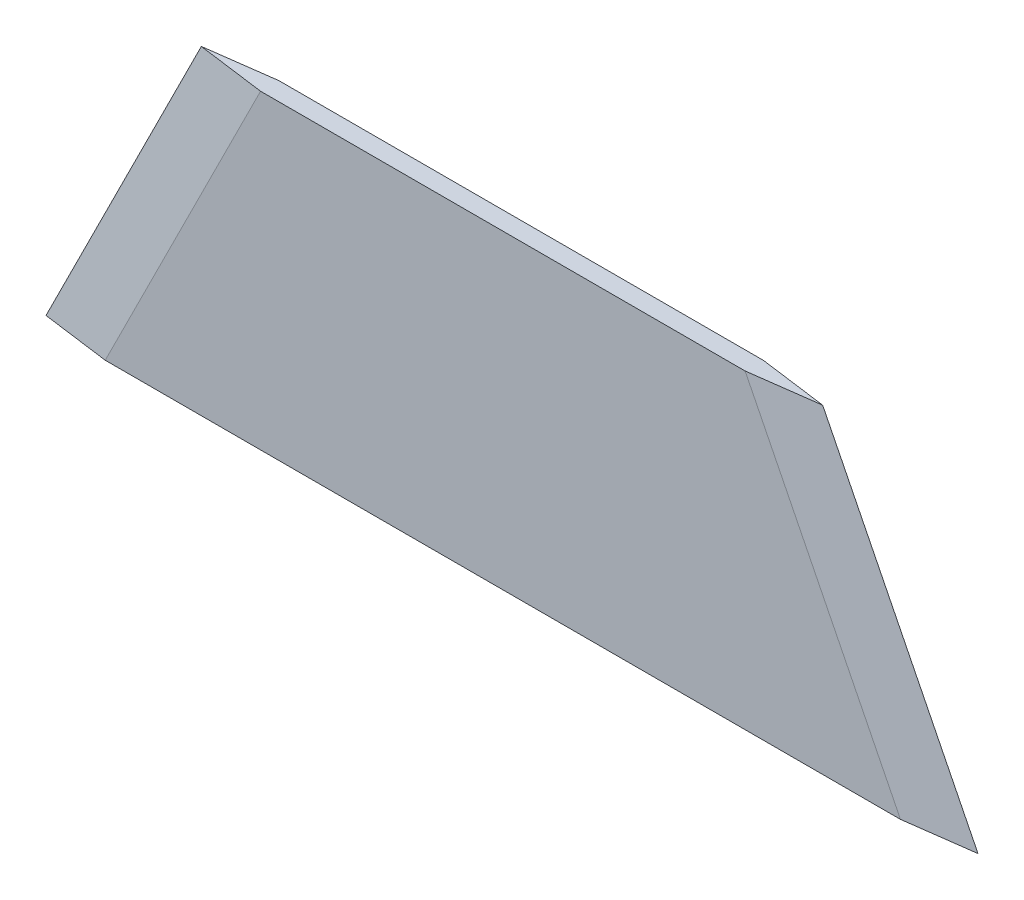
ISO-10303-21;
HEADER;
FILE_DESCRIPTION(('STEP AP214'),'2;1');
FILE_NAME('part.step','',(''),(''),'','','');
FILE_SCHEMA(('AUTOMOTIVE_DESIGN { 1 0 10303 214 1 1 1 1 }'));
ENDSEC;
DATA;
#1=APPLICATION_CONTEXT('core data for automotive mechanical design processes');
#2=APPLICATION_PROTOCOL_DEFINITION('international standard','automotive_design',2000,#1);
#3=PRODUCT_CONTEXT('',#1,'mechanical');
#4=PRODUCT('Part','Part','',(#3));
#5=PRODUCT_RELATED_PRODUCT_CATEGORY('part','',(#4));
#6=PRODUCT_DEFINITION_FORMATION('','',#4);
#7=PRODUCT_DEFINITION_CONTEXT('part definition',#1,'design');
#8=PRODUCT_DEFINITION('design','',#6,#7);
#9=PRODUCT_DEFINITION_SHAPE('','',#8);
#10=(LENGTH_UNIT() NAMED_UNIT(*) SI_UNIT(.MILLI.,.METRE.));
#11=(NAMED_UNIT(*) PLANE_ANGLE_UNIT() SI_UNIT($,.RADIAN.));
#12=(NAMED_UNIT(*) SI_UNIT($,.STERADIAN.) SOLID_ANGLE_UNIT());
#13=UNCERTAINTY_MEASURE_WITH_UNIT(LENGTH_MEASURE(1.E-05),#10,'distance_accuracy_value','');
#14=(GEOMETRIC_REPRESENTATION_CONTEXT(3) GLOBAL_UNCERTAINTY_ASSIGNED_CONTEXT((#13)) GLOBAL_UNIT_ASSIGNED_CONTEXT((#10,
#11,#12)) REPRESENTATION_CONTEXT('',''));
#15=CARTESIAN_POINT('',(0.,0.,0.));
#16=DIRECTION('',(0.,0.,1.));
#17=DIRECTION('',(1.,0.,0.));
#18=AXIS2_PLACEMENT_3D('',#15,#16,#17);
#19=CARTESIAN_POINT('',(0.,0.,1.4986));
#20=DIRECTION('',(0.,1.,0.));
#21=DIRECTION('',(0.,0.,1.));
#22=AXIS2_PLACEMENT_3D('',#19,#20,#21);
#23=PLANE('',#22);
#24=DIRECTION('',(1.,0.,0.));
#25=VECTOR('',#24,1.);
#26=CARTESIAN_POINT('',(0.,0.,-1.4986));
#27=LINE('',#26,#25);
#28=CARTESIAN_POINT('',(11.180339887499,0.,-1.4986));
#29=VERTEX_POINT('',#28);
#30=CARTESIAN_POINT('',(141.219660112501,0.,-1.4986));
#31=VERTEX_POINT('',#30);
#32=EDGE_CURVE('E93',#29,#31,#27,.T.);
#33=ORIENTED_EDGE('',*,*,#32,.T.);
#34=DIRECTION('',(0.991136054914381,0.,0.132850745759128));
#35=VECTOR('',#34,1.);
#36=CARTESIAN_POINT('',(127.448292744478,0.,-3.34449836672097));
#37=LINE('',#36,#35);
#38=CARTESIAN_POINT('',(152.4,0.,0.));
#39=VERTEX_POINT('',#38);
#40=EDGE_CURVE('E51',#31,#39,#37,.T.);
#41=ORIENTED_EDGE('',*,*,#40,.T.);
#42=DIRECTION('',(0.991136054914382,0.,-0.132850745759119));
#43=VECTOR('',#42,1.);
#44=CARTESIAN_POINT('',(113.474214302647,0.,5.21756789444983));
#45=LINE('',#44,#43);
#46=CARTESIAN_POINT('',(141.219660112501,0.,1.4986));
#47=VERTEX_POINT('',#46);
#48=EDGE_CURVE('E58',#39,#47,#45,.F.);
#49=ORIENTED_EDGE('',*,*,#48,.T.);
#50=DIRECTION('',(1.,0.,0.));
#51=VECTOR('',#50,1.);
#52=CARTESIAN_POINT('',(0.,0.,1.4986));
#53=LINE('',#52,#51);
#54=CARTESIAN_POINT('',(11.1803398874992,0.,1.4986));
#55=VERTEX_POINT('',#54);
#56=EDGE_CURVE('E162',#55,#47,#53,.T.);
#57=ORIENTED_EDGE('',*,*,#56,.F.);
#58=DIRECTION('',(0.991136054914382,0.,0.132850745759119));
#59=VECTOR('',#58,1.);
#60=CARTESIAN_POINT('',(8.98373699072674,0.,1.20416985438484));
#61=LINE('',#60,#59);
#62=CARTESIAN_POINT('',(0.,0.,0.));
#63=VERTEX_POINT('',#62);
#64=EDGE_CURVE('E95',#55,#63,#61,.F.);
#65=ORIENTED_EDGE('',*,*,#64,.T.);
#66=DIRECTION('',(0.991136054914381,0.,-0.132850745759128));
#67=VECTOR('',#66,1.);
#68=CARTESIAN_POINT('',(0.,0.,0.));
#69=LINE('',#68,#67);
#70=EDGE_CURVE('E91',#63,#29,#69,.T.);
#71=ORIENTED_EDGE('',*,*,#70,.T.);
#72=EDGE_LOOP('',(#33,#41,#49,#57,#65,#71));
#73=FACE_BOUND('',#72,.T.);
#74=ADVANCED_FACE('F40',(#73),#23,.F.);
#75=CARTESIAN_POINT('',(25.3999999999992,50.8,1.4986));
#76=DIRECTION('',(0.,-1.,0.));
#77=DIRECTION('',(0.,0.,-1.));
#78=AXIS2_PLACEMENT_3D('',#75,#76,#77);
#79=PLANE('',#78);
#80=DIRECTION('',(-0.991136054914383,0.,0.132850745759119));
#81=VECTOR('',#80,1.);
#82=CARTESIAN_POINT('',(113.025921558169,50.8,1.87306952772901));
#83=LINE('',#82,#81);
#84=CARTESIAN_POINT('',(115.819660112501,50.8,1.4986));
#85=VERTEX_POINT('',#84);
#86=CARTESIAN_POINT('',(127.,50.8,0.));
#87=VERTEX_POINT('',#86);
#88=EDGE_CURVE('E131',#85,#87,#83,.F.);
#89=ORIENTED_EDGE('',*,*,#88,.T.);
#90=DIRECTION('',(-0.991136054914381,0.,-0.132850745759128));
#91=VECTOR('',#90,1.);
#92=CARTESIAN_POINT('',(127.,50.8,0.));
#93=LINE('',#92,#91);
#94=CARTESIAN_POINT('',(115.819660112501,50.8,-1.4986));
#95=VERTEX_POINT('',#94);
#96=EDGE_CURVE('E136',#87,#95,#93,.T.);
#97=ORIENTED_EDGE('',*,*,#96,.T.);
#98=DIRECTION('',(-1.,0.,0.));
#99=VECTOR('',#98,1.);
#100=CARTESIAN_POINT('',(25.3999999999992,50.8,-1.4986));
#101=LINE('',#100,#99);
#102=CARTESIAN_POINT('',(36.5803398874981,50.8,-1.4986));
#103=VERTEX_POINT('',#102);
#104=EDGE_CURVE('E111',#95,#103,#101,.T.);
#105=ORIENTED_EDGE('',*,*,#104,.T.);
#106=DIRECTION('',(-0.991136054914381,0.,0.132850745759128));
#107=VECTOR('',#106,1.);
#108=CARTESIAN_POINT('',(0.448292744477552,50.8,3.34449836672111));
#109=LINE('',#108,#107);
#110=CARTESIAN_POINT('',(25.3999999999992,50.8,0.));
#111=VERTEX_POINT('',#110);
#112=EDGE_CURVE('E116',#103,#111,#109,.T.);
#113=ORIENTED_EDGE('',*,*,#112,.T.);
#114=DIRECTION('',(-0.991136054914383,0.,-0.132850745759119));
#115=VECTOR('',#114,1.);
#116=CARTESIAN_POINT('',(9.43202973520418,50.8,-2.14032851233598));
#117=LINE('',#116,#115);
#118=CARTESIAN_POINT('',(36.5803398874984,50.8,1.4986));
#119=VERTEX_POINT('',#118);
#120=EDGE_CURVE('E118',#111,#119,#117,.F.);
#121=ORIENTED_EDGE('',*,*,#120,.T.);
#122=DIRECTION('',(-1.,0.,0.));
#123=VECTOR('',#122,1.);
#124=CARTESIAN_POINT('',(25.3999999999992,50.8,1.4986));
#125=LINE('',#124,#123);
#126=EDGE_CURVE('E174',#85,#119,#125,.T.);
#127=ORIENTED_EDGE('',*,*,#126,.F.);
#128=EDGE_LOOP('',(#89,#97,#105,#113,#121,#127));
#129=FACE_BOUND('',#128,.T.);
#130=ADVANCED_FACE('F155',(#129),#79,.F.);
#131=CARTESIAN_POINT('',(0.,0.,1.4986));
#132=DIRECTION('',(0.,0.,-1.));
#133=DIRECTION('',(-1.,0.,0.));
#134=AXIS2_PLACEMENT_3D('',#131,#132,#133);
#135=PLANE('',#134);
#136=ORIENTED_EDGE('',*,*,#56,.T.);
#137=DIRECTION('',(-0.447213595499958,0.894427190999916,0.));
#138=VECTOR('',#137,1.);
#139=CARTESIAN_POINT('',(112.975728090001,56.4878640450003,1.4986));
#140=LINE('',#139,#138);
#141=EDGE_CURVE('E11',#47,#85,#140,.T.);
#142=ORIENTED_EDGE('',*,*,#141,.T.);
#143=ORIENTED_EDGE('',*,*,#126,.T.);
#144=DIRECTION('',(-0.447213595499958,-0.894427190999916,0.));
#145=VECTOR('',#144,1.);
#146=CARTESIAN_POINT('',(8.94427190999936,-4.47213595499969,1.4986));
#147=LINE('',#146,#145);
#148=EDGE_CURVE('E128',#119,#55,#147,.T.);
#149=ORIENTED_EDGE('',*,*,#148,.T.);
#150=EDGE_LOOP('',(#136,#142,#143,#149));
#151=FACE_BOUND('',#150,.T.);
#152=ADVANCED_FACE('F182',(#151),#135,.F.);
#153=CARTESIAN_POINT('',(0.,0.,-1.4986));
#154=DIRECTION('',(0.,0.,-1.));
#155=DIRECTION('',(-1.,0.,0.));
#156=AXIS2_PLACEMENT_3D('',#153,#154,#155);
#157=PLANE('',#156);
#158=ORIENTED_EDGE('',*,*,#104,.F.);
#159=DIRECTION('',(0.447213595499958,-0.894427190999916,0.));
#160=VECTOR('',#159,1.);
#161=CARTESIAN_POINT('',(143.455728090001,-4.47213595499959,-1.4986));
#162=LINE('',#161,#160);
#163=EDGE_CURVE('E109',#95,#31,#162,.T.);
#164=ORIENTED_EDGE('',*,*,#163,.T.);
#165=ORIENTED_EDGE('',*,*,#32,.F.);
#166=DIRECTION('',(0.447213595499958,0.894427190999916,0.));
#167=VECTOR('',#166,1.);
#168=CARTESIAN_POINT('',(34.3442719099991,46.3278640450004,-1.4986));
#169=LINE('',#168,#167);
#170=EDGE_CURVE('E101',#29,#103,#169,.T.);
#171=ORIENTED_EDGE('',*,*,#170,.T.);
#172=EDGE_LOOP('',(#158,#164,#165,#171));
#173=FACE_BOUND('',#172,.T.);
#174=ADVANCED_FACE('F107',(#173),#157,.T.);
#175=CARTESIAN_POINT('',(8.94427190999936,-4.47213595499969,1.4986));
#176=DIRECTION('',(0.132558621439864,-0.0662793107199322,-0.988956654688391));
#177=DIRECTION('',(-0.447213595499958,-0.894427190999916,0.));
#178=AXIS2_PLACEMENT_3D('',#175,#176,#177);
#179=PLANE('',#178);
#180=ORIENTED_EDGE('',*,*,#148,.F.);
#181=ORIENTED_EDGE('',*,*,#120,.F.);
#182=DIRECTION('',(0.447213595499958,0.894427190999916,0.));
#183=VECTOR('',#182,1.);
#184=CARTESIAN_POINT('',(0.,0.,0.));
#185=LINE('',#184,#183);
#186=EDGE_CURVE('E112',#63,#111,#185,.T.);
#187=ORIENTED_EDGE('',*,*,#186,.F.);
#188=ORIENTED_EDGE('',*,*,#64,.F.);
#189=EDGE_LOOP('',(#180,#181,#187,#188));
#190=FACE_BOUND('',#189,.T.);
#191=ADVANCED_FACE('F187',(#190),#179,.F.);
#192=CARTESIAN_POINT('',(0.,0.,0.));
#193=DIRECTION('',(-0.132558621439873,0.0662793107199366,-0.988956654688389));
#194=DIRECTION('',(0.447213595499958,0.894427190999916,0.));
#195=AXIS2_PLACEMENT_3D('',#192,#193,#194);
#196=PLANE('',#195);
#197=ORIENTED_EDGE('',*,*,#112,.F.);
#198=ORIENTED_EDGE('',*,*,#170,.F.);
#199=ORIENTED_EDGE('',*,*,#70,.F.);
#200=ORIENTED_EDGE('',*,*,#186,.T.);
#201=EDGE_LOOP('',(#197,#198,#199,#200));
#202=FACE_BOUND('',#201,.T.);
#203=ADVANCED_FACE('F115',(#202),#196,.T.);
#204=CARTESIAN_POINT('',(112.975728090001,56.4878640450003,1.4986));
#205=DIRECTION('',(-0.132558621439864,-0.0662793107199321,-0.988956654688391));
#206=DIRECTION('',(-0.447213595499958,0.894427190999916,0.));
#207=AXIS2_PLACEMENT_3D('',#204,#205,#206);
#208=PLANE('',#207);
#209=ORIENTED_EDGE('',*,*,#141,.F.);
#210=ORIENTED_EDGE('',*,*,#48,.F.);
#211=DIRECTION('',(0.447213595499958,-0.894427190999916,0.));
#212=VECTOR('',#211,1.);
#213=CARTESIAN_POINT('',(127.,50.8,0.));
#214=LINE('',#213,#212);
#215=EDGE_CURVE('E45',#87,#39,#214,.T.);
#216=ORIENTED_EDGE('',*,*,#215,.F.);
#217=ORIENTED_EDGE('',*,*,#88,.F.);
#218=EDGE_LOOP('',(#209,#210,#216,#217));
#219=FACE_BOUND('',#218,.T.);
#220=ADVANCED_FACE('F43',(#219),#208,.F.);
#221=CARTESIAN_POINT('',(127.,50.8,0.));
#222=DIRECTION('',(0.132558621439873,0.0662793107199366,-0.988956654688389));
#223=DIRECTION('',(0.447213595499958,-0.894427190999916,0.));
#224=AXIS2_PLACEMENT_3D('',#221,#222,#223);
#225=PLANE('',#224);
#226=ORIENTED_EDGE('',*,*,#40,.F.);
#227=ORIENTED_EDGE('',*,*,#163,.F.);
#228=ORIENTED_EDGE('',*,*,#96,.F.);
#229=ORIENTED_EDGE('',*,*,#215,.T.);
#230=EDGE_LOOP('',(#226,#227,#228,#229));
#231=FACE_BOUND('',#230,.T.);
#232=ADVANCED_FACE('F164',(#231),#225,.T.);
#233=CLOSED_SHELL('',(#74,#130,#152,#174,#191,#203,#220,#232));
#234=MANIFOLD_SOLID_BREP('B2',#233);
#235=ADVANCED_BREP_SHAPE_REPRESENTATION('',(#18,#234),#14);
#236=SHAPE_DEFINITION_REPRESENTATION(#9,#235);
ENDSEC;
END-ISO-10303-21;
